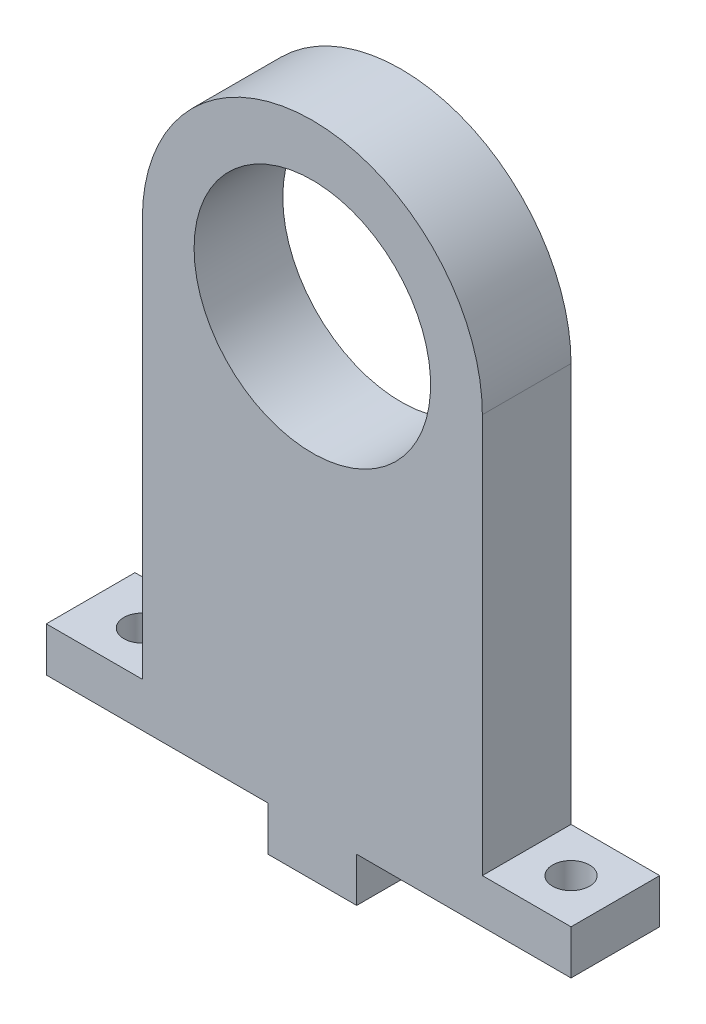
ISO-10303-21;
HEADER;
FILE_DESCRIPTION(('STEP AP214'),'2;1');
FILE_NAME('part.step','',(''),(''),'','','');
FILE_SCHEMA(('AUTOMOTIVE_DESIGN { 1 0 10303 214 1 1 1 1 }'));
ENDSEC;
DATA;
#1=APPLICATION_CONTEXT('core data for automotive mechanical design processes');
#2=APPLICATION_PROTOCOL_DEFINITION('international standard','automotive_design',2000,#1);
#3=PRODUCT_CONTEXT('',#1,'mechanical');
#4=PRODUCT('Part','Part','',(#3));
#5=PRODUCT_RELATED_PRODUCT_CATEGORY('part','',(#4));
#6=PRODUCT_DEFINITION_FORMATION('','',#4);
#7=PRODUCT_DEFINITION_CONTEXT('part definition',#1,'design');
#8=PRODUCT_DEFINITION('design','',#6,#7);
#9=PRODUCT_DEFINITION_SHAPE('','',#8);
#10=(LENGTH_UNIT() NAMED_UNIT(*) SI_UNIT(.MILLI.,.METRE.));
#11=(NAMED_UNIT(*) PLANE_ANGLE_UNIT() SI_UNIT($,.RADIAN.));
#12=(NAMED_UNIT(*) SI_UNIT($,.STERADIAN.) SOLID_ANGLE_UNIT());
#13=UNCERTAINTY_MEASURE_WITH_UNIT(LENGTH_MEASURE(1.E-05),#10,'distance_accuracy_value','');
#14=(GEOMETRIC_REPRESENTATION_CONTEXT(3) GLOBAL_UNCERTAINTY_ASSIGNED_CONTEXT((#13)) GLOBAL_UNIT_ASSIGNED_CONTEXT((#10,
#11,#12)) REPRESENTATION_CONTEXT('',''));
#15=CARTESIAN_POINT('',(0.,0.,0.));
#16=DIRECTION('',(0.,0.,1.));
#17=DIRECTION('',(1.,0.,0.));
#18=AXIS2_PLACEMENT_3D('',#15,#16,#17);
#19=CARTESIAN_POINT('',(14.5,-30.,3.));
#20=DIRECTION('',(0.,1.,0.));
#21=DIRECTION('',(0.,0.,1.));
#22=AXIS2_PLACEMENT_3D('',#19,#20,#21);
#23=CYLINDRICAL_SURFACE('',#22,1.25);
#24=CARTESIAN_POINT('',(14.5,-30.,3.));
#25=DIRECTION('',(0.,1.,0.));
#26=DIRECTION('',(0.,0.,1.));
#27=AXIS2_PLACEMENT_3D('',#24,#25,#26);
#28=CIRCLE('',#27,1.25);
#29=CARTESIAN_POINT('',(14.5,-30.,4.25));
#30=VERTEX_POINT('',#29);
#31=EDGE_CURVE('E20',#30,#30,#28,.F.);
#32=ORIENTED_EDGE('',*,*,#31,.T.);
#33=EDGE_LOOP('',(#32));
#34=FACE_BOUND('',#33,.T.);
#35=CARTESIAN_POINT('',(14.5,-27.,3.));
#36=DIRECTION('',(0.,1.,0.));
#37=DIRECTION('',(0.,0.,1.));
#38=AXIS2_PLACEMENT_3D('',#35,#36,#37);
#39=CIRCLE('',#38,1.25);
#40=CARTESIAN_POINT('',(14.5,-27.,4.25));
#41=VERTEX_POINT('',#40);
#42=EDGE_CURVE('E157',#41,#41,#39,.T.);
#43=ORIENTED_EDGE('',*,*,#42,.T.);
#44=EDGE_LOOP('',(#43));
#45=FACE_BOUND('',#44,.T.);
#46=ADVANCED_FACE('F17',(#34,#45),#23,.F.);
#47=CARTESIAN_POINT('',(-14.5,-30.,3.));
#48=DIRECTION('',(0.,1.,0.));
#49=DIRECTION('',(0.,0.,1.));
#50=AXIS2_PLACEMENT_3D('',#47,#48,#49);
#51=CYLINDRICAL_SURFACE('',#50,1.25);
#52=CARTESIAN_POINT('',(-14.5,-30.,3.));
#53=DIRECTION('',(0.,1.,0.));
#54=DIRECTION('',(0.,0.,1.));
#55=AXIS2_PLACEMENT_3D('',#52,#53,#54);
#56=CIRCLE('',#55,1.25);
#57=CARTESIAN_POINT('',(-14.5,-30.,4.25));
#58=VERTEX_POINT('',#57);
#59=EDGE_CURVE('E253',#58,#58,#56,.F.);
#60=ORIENTED_EDGE('',*,*,#59,.T.);
#61=EDGE_LOOP('',(#60));
#62=FACE_BOUND('',#61,.T.);
#63=CARTESIAN_POINT('',(-14.5,-27.,3.));
#64=DIRECTION('',(0.,1.,0.));
#65=DIRECTION('',(0.,0.,1.));
#66=AXIS2_PLACEMENT_3D('',#63,#64,#65);
#67=CIRCLE('',#66,1.25);
#68=CARTESIAN_POINT('',(-14.5,-27.,4.25));
#69=VERTEX_POINT('',#68);
#70=EDGE_CURVE('E281',#69,#69,#67,.T.);
#71=ORIENTED_EDGE('',*,*,#70,.T.);
#72=EDGE_LOOP('',(#71));
#73=FACE_BOUND('',#72,.T.);
#74=ADVANCED_FACE('F476',(#62,#73),#51,.F.);
#75=CARTESIAN_POINT('',(0.,0.,6.));
#76=DIRECTION('',(0.,0.,1.));
#77=DIRECTION('',(1.,0.,0.));
#78=AXIS2_PLACEMENT_3D('',#75,#76,#77);
#79=PLANE('',#78);
#80=CARTESIAN_POINT('',(0.,0.,6.));
#81=DIRECTION('',(0.,0.,-1.));
#82=DIRECTION('',(-1.,0.,0.));
#83=AXIS2_PLACEMENT_3D('',#80,#81,#82);
#84=CIRCLE('',#83,8.);
#85=CARTESIAN_POINT('',(-8.,0.,6.));
#86=VERTEX_POINT('',#85);
#87=EDGE_CURVE('E177',#86,#86,#84,.T.);
#88=ORIENTED_EDGE('',*,*,#87,.T.);
#89=EDGE_LOOP('',(#88));
#90=FACE_BOUND('',#89,.T.);
#91=DIRECTION('',(1.,0.,0.));
#92=VECTOR('',#91,1.);
#93=CARTESIAN_POINT('',(-2.99999999999998,-30.,6.));
#94=LINE('',#93,#92);
#95=CARTESIAN_POINT('',(-18.,-30.,6.));
#96=VERTEX_POINT('',#95);
#97=CARTESIAN_POINT('',(-2.99999999999998,-30.,6.));
#98=VERTEX_POINT('',#97);
#99=EDGE_CURVE('E236',#96,#98,#94,.T.);
#100=ORIENTED_EDGE('',*,*,#99,.T.);
#101=DIRECTION('',(0.,1.,0.));
#102=VECTOR('',#101,1.);
#103=CARTESIAN_POINT('',(-2.99999999999998,-33.,6.));
#104=LINE('',#103,#102);
#105=CARTESIAN_POINT('',(-2.99999999999998,-33.,6.));
#106=VERTEX_POINT('',#105);
#107=EDGE_CURVE('E219',#98,#106,#104,.F.);
#108=ORIENTED_EDGE('',*,*,#107,.T.);
#109=DIRECTION('',(1.,0.,0.));
#110=VECTOR('',#109,1.);
#111=CARTESIAN_POINT('',(0.,-33.,6.));
#112=LINE('',#111,#110);
#113=CARTESIAN_POINT('',(3.00000000000002,-33.,6.));
#114=VERTEX_POINT('',#113);
#115=EDGE_CURVE('E203',#106,#114,#112,.T.);
#116=ORIENTED_EDGE('',*,*,#115,.T.);
#117=DIRECTION('',(0.,-1.,0.));
#118=VECTOR('',#117,1.);
#119=CARTESIAN_POINT('',(3.00000000000002,-33.,6.));
#120=LINE('',#119,#118);
#121=CARTESIAN_POINT('',(3.00000000000002,-30.,6.));
#122=VERTEX_POINT('',#121);
#123=EDGE_CURVE('E184',#114,#122,#120,.F.);
#124=ORIENTED_EDGE('',*,*,#123,.T.);
#125=DIRECTION('',(-1.,0.,0.));
#126=VECTOR('',#125,1.);
#127=CARTESIAN_POINT('',(17.5,-30.,6.));
#128=LINE('',#127,#126);
#129=CARTESIAN_POINT('',(17.5,-30.,6.));
#130=VERTEX_POINT('',#129);
#131=EDGE_CURVE('E171',#122,#130,#128,.F.);
#132=ORIENTED_EDGE('',*,*,#131,.T.);
#133=DIRECTION('',(0.,1.,0.));
#134=VECTOR('',#133,1.);
#135=CARTESIAN_POINT('',(17.5,-27.,6.));
#136=LINE('',#135,#134);
#137=CARTESIAN_POINT('',(17.5,-27.,6.));
#138=VERTEX_POINT('',#137);
#139=EDGE_CURVE('E170',#130,#138,#136,.T.);
#140=ORIENTED_EDGE('',*,*,#139,.T.);
#141=DIRECTION('',(1.,0.,0.));
#142=VECTOR('',#141,1.);
#143=CARTESIAN_POINT('',(11.5,-27.,6.));
#144=LINE('',#143,#142);
#145=CARTESIAN_POINT('',(11.5,-27.,6.));
#146=VERTEX_POINT('',#145);
#147=EDGE_CURVE('E120',#138,#146,#144,.F.);
#148=ORIENTED_EDGE('',*,*,#147,.T.);
#149=DIRECTION('',(0.,-1.,0.));
#150=VECTOR('',#149,1.);
#151=CARTESIAN_POINT('',(11.5,0.,6.));
#152=LINE('',#151,#150);
#153=CARTESIAN_POINT('',(11.5,0.,6.));
#154=VERTEX_POINT('',#153);
#155=EDGE_CURVE('E115',#146,#154,#152,.F.);
#156=ORIENTED_EDGE('',*,*,#155,.T.);
#157=CARTESIAN_POINT('',(0.,0.,6.));
#158=DIRECTION('',(0.,0.,-1.));
#159=DIRECTION('',(-1.,0.,0.));
#160=AXIS2_PLACEMENT_3D('',#157,#158,#159);
#161=CIRCLE('',#160,11.5);
#162=CARTESIAN_POINT('',(-11.5,0.,6.));
#163=VERTEX_POINT('',#162);
#164=EDGE_CURVE('E104',#163,#154,#161,.T.);
#165=ORIENTED_EDGE('',*,*,#164,.F.);
#166=DIRECTION('',(0.,1.,0.));
#167=VECTOR('',#166,1.);
#168=CARTESIAN_POINT('',(-11.5,0.,6.));
#169=LINE('',#168,#167);
#170=CARTESIAN_POINT('',(-11.5,-27.,6.));
#171=VERTEX_POINT('',#170);
#172=EDGE_CURVE('E136',#163,#171,#169,.F.);
#173=ORIENTED_EDGE('',*,*,#172,.T.);
#174=DIRECTION('',(1.,0.,0.));
#175=VECTOR('',#174,1.);
#176=CARTESIAN_POINT('',(-11.5,-27.,6.));
#177=LINE('',#176,#175);
#178=CARTESIAN_POINT('',(-18.,-27.,6.));
#179=VERTEX_POINT('',#178);
#180=EDGE_CURVE('E271',#171,#179,#177,.F.);
#181=ORIENTED_EDGE('',*,*,#180,.T.);
#182=DIRECTION('',(0.,1.,0.));
#183=VECTOR('',#182,1.);
#184=CARTESIAN_POINT('',(-18.,-27.,6.));
#185=LINE('',#184,#183);
#186=EDGE_CURVE('E256',#179,#96,#185,.F.);
#187=ORIENTED_EDGE('',*,*,#186,.T.);
#188=EDGE_LOOP('',(#100,#108,#116,#124,#132,#140,#148,#156,#165,#173,#181,#187));
#189=FACE_BOUND('',#188,.T.);
#190=ADVANCED_FACE('F118',(#90,#189),#79,.T.);
#191=CARTESIAN_POINT('',(17.5,-30.,6.));
#192=DIRECTION('',(0.,1.,0.));
#193=DIRECTION('',(-1.,0.,0.));
#194=AXIS2_PLACEMENT_3D('',#191,#192,#193);
#195=PLANE('',#194);
#196=DIRECTION('',(0.,0.,1.));
#197=VECTOR('',#196,1.);
#198=CARTESIAN_POINT('',(17.5,-30.,6.));
#199=LINE('',#198,#197);
#200=CARTESIAN_POINT('',(17.5,-30.,0.));
#201=VERTEX_POINT('',#200);
#202=EDGE_CURVE('E166',#201,#130,#199,.T.);
#203=ORIENTED_EDGE('',*,*,#202,.T.);
#204=ORIENTED_EDGE('',*,*,#131,.F.);
#205=DIRECTION('',(0.,0.,1.));
#206=VECTOR('',#205,1.);
#207=CARTESIAN_POINT('',(3.00000000000002,-30.,6.));
#208=LINE('',#207,#206);
#209=CARTESIAN_POINT('',(3.00000000000002,-30.,0.));
#210=VERTEX_POINT('',#209);
#211=EDGE_CURVE('E180',#122,#210,#208,.F.);
#212=ORIENTED_EDGE('',*,*,#211,.T.);
#213=DIRECTION('',(1.,0.,0.));
#214=VECTOR('',#213,1.);
#215=CARTESIAN_POINT('',(0.,-30.,0.));
#216=LINE('',#215,#214);
#217=EDGE_CURVE('E163',#210,#201,#216,.T.);
#218=ORIENTED_EDGE('',*,*,#217,.T.);
#219=EDGE_LOOP('',(#203,#204,#212,#218));
#220=FACE_BOUND('',#219,.T.);
#221=ORIENTED_EDGE('',*,*,#31,.F.);
#222=EDGE_LOOP('',(#221));
#223=FACE_BOUND('',#222,.T.);
#224=ADVANCED_FACE('F321',(#220,#223),#195,.F.);
#225=CARTESIAN_POINT('',(17.5,-27.,6.));
#226=DIRECTION('',(-1.,0.,0.));
#227=DIRECTION('',(0.,0.,1.));
#228=AXIS2_PLACEMENT_3D('',#225,#226,#227);
#229=PLANE('',#228);
#230=DIRECTION('',(0.,0.,-1.));
#231=VECTOR('',#230,1.);
#232=CARTESIAN_POINT('',(17.5,-27.,6.));
#233=LINE('',#232,#231);
#234=CARTESIAN_POINT('',(17.5,-27.,0.));
#235=VERTEX_POINT('',#234);
#236=EDGE_CURVE('E153',#235,#138,#233,.F.);
#237=ORIENTED_EDGE('',*,*,#236,.T.);
#238=ORIENTED_EDGE('',*,*,#139,.F.);
#239=ORIENTED_EDGE('',*,*,#202,.F.);
#240=DIRECTION('',(0.,1.,0.));
#241=VECTOR('',#240,1.);
#242=CARTESIAN_POINT('',(17.5,0.,0.));
#243=LINE('',#242,#241);
#244=EDGE_CURVE('E150',#201,#235,#243,.T.);
#245=ORIENTED_EDGE('',*,*,#244,.T.);
#246=EDGE_LOOP('',(#237,#238,#239,#245));
#247=FACE_BOUND('',#246,.T.);
#248=ADVANCED_FACE('F312',(#247),#229,.F.);
#249=CARTESIAN_POINT('',(11.5,-27.,6.));
#250=DIRECTION('',(0.,-1.,0.));
#251=DIRECTION('',(0.,0.,-1.));
#252=AXIS2_PLACEMENT_3D('',#249,#250,#251);
#253=PLANE('',#252);
#254=DIRECTION('',(0.,0.,1.));
#255=VECTOR('',#254,1.);
#256=CARTESIAN_POINT('',(11.5,-27.,6.));
#257=LINE('',#256,#255);
#258=CARTESIAN_POINT('',(11.5,-27.,0.));
#259=VERTEX_POINT('',#258);
#260=EDGE_CURVE('E124',#259,#146,#257,.T.);
#261=ORIENTED_EDGE('',*,*,#260,.T.);
#262=ORIENTED_EDGE('',*,*,#147,.F.);
#263=ORIENTED_EDGE('',*,*,#236,.F.);
#264=DIRECTION('',(1.,0.,0.));
#265=VECTOR('',#264,1.);
#266=CARTESIAN_POINT('',(0.,-27.,0.));
#267=LINE('',#266,#265);
#268=EDGE_CURVE('E146',#235,#259,#267,.F.);
#269=ORIENTED_EDGE('',*,*,#268,.T.);
#270=EDGE_LOOP('',(#261,#262,#263,#269));
#271=FACE_BOUND('',#270,.T.);
#272=ORIENTED_EDGE('',*,*,#42,.F.);
#273=EDGE_LOOP('',(#272));
#274=FACE_BOUND('',#273,.T.);
#275=ADVANCED_FACE('F310',(#271,#274),#253,.F.);
#276=CARTESIAN_POINT('',(11.5,0.,6.));
#277=DIRECTION('',(-1.,0.,0.));
#278=DIRECTION('',(0.,-1.,0.));
#279=AXIS2_PLACEMENT_3D('',#276,#277,#278);
#280=PLANE('',#279);
#281=DIRECTION('',(0.,0.,-1.));
#282=VECTOR('',#281,1.);
#283=CARTESIAN_POINT('',(11.5,0.,6.));
#284=LINE('',#283,#282);
#285=CARTESIAN_POINT('',(11.5,0.,0.));
#286=VERTEX_POINT('',#285);
#287=EDGE_CURVE('E111',#154,#286,#284,.T.);
#288=ORIENTED_EDGE('',*,*,#287,.F.);
#289=ORIENTED_EDGE('',*,*,#155,.F.);
#290=ORIENTED_EDGE('',*,*,#260,.F.);
#291=DIRECTION('',(0.,1.,0.));
#292=VECTOR('',#291,1.);
#293=CARTESIAN_POINT('',(11.5,0.,0.));
#294=LINE('',#293,#292);
#295=EDGE_CURVE('E129',#259,#286,#294,.T.);
#296=ORIENTED_EDGE('',*,*,#295,.T.);
#297=EDGE_LOOP('',(#288,#289,#290,#296));
#298=FACE_BOUND('',#297,.T.);
#299=ADVANCED_FACE('F127',(#298),#280,.F.);
#300=CARTESIAN_POINT('',(0.,0.,6.));
#301=DIRECTION('',(0.,0.,-1.));
#302=DIRECTION('',(-1.,0.,0.));
#303=AXIS2_PLACEMENT_3D('',#300,#301,#302);
#304=CYLINDRICAL_SURFACE('',#303,11.5);
#305=ORIENTED_EDGE('',*,*,#164,.T.);
#306=ORIENTED_EDGE('',*,*,#287,.T.);
#307=CARTESIAN_POINT('',(0.,0.,0.));
#308=DIRECTION('',(0.,0.,-1.));
#309=DIRECTION('',(-1.,0.,0.));
#310=AXIS2_PLACEMENT_3D('',#307,#308,#309);
#311=CIRCLE('',#310,11.5);
#312=CARTESIAN_POINT('',(-11.5,0.,0.));
#313=VERTEX_POINT('',#312);
#314=EDGE_CURVE('E294',#286,#313,#311,.F.);
#315=ORIENTED_EDGE('',*,*,#314,.T.);
#316=DIRECTION('',(0.,0.,1.));
#317=VECTOR('',#316,1.);
#318=CARTESIAN_POINT('',(-11.5,0.,6.));
#319=LINE('',#318,#317);
#320=EDGE_CURVE('E113',#313,#163,#319,.T.);
#321=ORIENTED_EDGE('',*,*,#320,.T.);
#322=EDGE_LOOP('',(#305,#306,#315,#321));
#323=FACE_BOUND('',#322,.T.);
#324=ADVANCED_FACE('F108',(#323),#304,.T.);
#325=CARTESIAN_POINT('',(-11.5,0.,6.));
#326=DIRECTION('',(1.,0.,0.));
#327=DIRECTION('',(0.,1.,0.));
#328=AXIS2_PLACEMENT_3D('',#325,#326,#327);
#329=PLANE('',#328);
#330=DIRECTION('',(0.,0.,1.));
#331=VECTOR('',#330,1.);
#332=CARTESIAN_POINT('',(-11.5,-27.,6.));
#333=LINE('',#332,#331);
#334=CARTESIAN_POINT('',(-11.5,-27.,0.));
#335=VERTEX_POINT('',#334);
#336=EDGE_CURVE('E276',#335,#171,#333,.T.);
#337=ORIENTED_EDGE('',*,*,#336,.T.);
#338=ORIENTED_EDGE('',*,*,#172,.F.);
#339=ORIENTED_EDGE('',*,*,#320,.F.);
#340=DIRECTION('',(0.,1.,0.));
#341=VECTOR('',#340,1.);
#342=CARTESIAN_POINT('',(-11.5,0.,0.));
#343=LINE('',#342,#341);
#344=EDGE_CURVE('E296',#313,#335,#343,.F.);
#345=ORIENTED_EDGE('',*,*,#344,.T.);
#346=EDGE_LOOP('',(#337,#338,#339,#345));
#347=FACE_BOUND('',#346,.T.);
#348=ADVANCED_FACE('F359',(#347),#329,.F.);
#349=CARTESIAN_POINT('',(-11.5,-27.,6.));
#350=DIRECTION('',(0.,-1.,0.));
#351=DIRECTION('',(1.,0.,0.));
#352=AXIS2_PLACEMENT_3D('',#349,#350,#351);
#353=PLANE('',#352);
#354=DIRECTION('',(0.,0.,1.));
#355=VECTOR('',#354,1.);
#356=CARTESIAN_POINT('',(-18.,-27.,6.));
#357=LINE('',#356,#355);
#358=CARTESIAN_POINT('',(-18.,-27.,0.));
#359=VERTEX_POINT('',#358);
#360=EDGE_CURVE('E259',#359,#179,#357,.T.);
#361=ORIENTED_EDGE('',*,*,#360,.T.);
#362=ORIENTED_EDGE('',*,*,#180,.F.);
#363=ORIENTED_EDGE('',*,*,#336,.F.);
#364=DIRECTION('',(1.,0.,0.));
#365=VECTOR('',#364,1.);
#366=CARTESIAN_POINT('',(0.,-27.,0.));
#367=LINE('',#366,#365);
#368=EDGE_CURVE('E265',#335,#359,#367,.F.);
#369=ORIENTED_EDGE('',*,*,#368,.T.);
#370=EDGE_LOOP('',(#361,#362,#363,#369));
#371=FACE_BOUND('',#370,.T.);
#372=ORIENTED_EDGE('',*,*,#70,.F.);
#373=EDGE_LOOP('',(#372));
#374=FACE_BOUND('',#373,.T.);
#375=ADVANCED_FACE('F355',(#371,#374),#353,.F.);
#376=CARTESIAN_POINT('',(-18.,-27.,6.));
#377=DIRECTION('',(1.,0.,0.));
#378=DIRECTION('',(0.,1.,0.));
#379=AXIS2_PLACEMENT_3D('',#376,#377,#378);
#380=PLANE('',#379);
#381=DIRECTION('',(0.,0.,1.));
#382=VECTOR('',#381,1.);
#383=CARTESIAN_POINT('',(-18.,-30.,6.));
#384=LINE('',#383,#382);
#385=CARTESIAN_POINT('',(-18.,-30.,0.));
#386=VERTEX_POINT('',#385);
#387=EDGE_CURVE('E241',#386,#96,#384,.T.);
#388=ORIENTED_EDGE('',*,*,#387,.T.);
#389=ORIENTED_EDGE('',*,*,#186,.F.);
#390=ORIENTED_EDGE('',*,*,#360,.F.);
#391=DIRECTION('',(0.,1.,0.));
#392=VECTOR('',#391,1.);
#393=CARTESIAN_POINT('',(-18.,0.,0.));
#394=LINE('',#393,#392);
#395=EDGE_CURVE('E247',#359,#386,#394,.F.);
#396=ORIENTED_EDGE('',*,*,#395,.T.);
#397=EDGE_LOOP('',(#388,#389,#390,#396));
#398=FACE_BOUND('',#397,.T.);
#399=ADVANCED_FACE('F351',(#398),#380,.F.);
#400=CARTESIAN_POINT('',(-2.99999999999998,-30.,6.));
#401=DIRECTION('',(0.,1.,0.));
#402=DIRECTION('',(0.,0.,1.));
#403=AXIS2_PLACEMENT_3D('',#400,#401,#402);
#404=PLANE('',#403);
#405=DIRECTION('',(0.,0.,-1.));
#406=VECTOR('',#405,1.);
#407=CARTESIAN_POINT('',(-2.99999999999998,-30.,6.));
#408=LINE('',#407,#406);
#409=CARTESIAN_POINT('',(-2.99999999999998,-30.,0.));
#410=VERTEX_POINT('',#409);
#411=EDGE_CURVE('E224',#410,#98,#408,.F.);
#412=ORIENTED_EDGE('',*,*,#411,.T.);
#413=ORIENTED_EDGE('',*,*,#99,.F.);
#414=ORIENTED_EDGE('',*,*,#387,.F.);
#415=DIRECTION('',(1.,0.,0.));
#416=VECTOR('',#415,1.);
#417=CARTESIAN_POINT('',(0.,-30.,0.));
#418=LINE('',#417,#416);
#419=EDGE_CURVE('E230',#386,#410,#418,.T.);
#420=ORIENTED_EDGE('',*,*,#419,.T.);
#421=EDGE_LOOP('',(#412,#413,#414,#420));
#422=FACE_BOUND('',#421,.T.);
#423=ORIENTED_EDGE('',*,*,#59,.F.);
#424=EDGE_LOOP('',(#423));
#425=FACE_BOUND('',#424,.T.);
#426=ADVANCED_FACE('F347',(#422,#425),#404,.F.);
#427=CARTESIAN_POINT('',(-2.99999999999998,-33.,6.));
#428=DIRECTION('',(1.,0.,0.));
#429=DIRECTION('',(0.,0.,-1.));
#430=AXIS2_PLACEMENT_3D('',#427,#428,#429);
#431=PLANE('',#430);
#432=DIRECTION('',(0.,0.,1.));
#433=VECTOR('',#432,1.);
#434=CARTESIAN_POINT('',(-2.99999999999998,-33.,6.));
#435=LINE('',#434,#433);
#436=CARTESIAN_POINT('',(-2.99999999999998,-33.,0.));
#437=VERTEX_POINT('',#436);
#438=EDGE_CURVE('E208',#437,#106,#435,.T.);
#439=ORIENTED_EDGE('',*,*,#438,.T.);
#440=ORIENTED_EDGE('',*,*,#107,.F.);
#441=ORIENTED_EDGE('',*,*,#411,.F.);
#442=DIRECTION('',(0.,1.,0.));
#443=VECTOR('',#442,1.);
#444=CARTESIAN_POINT('',(-2.99999999999998,0.,0.));
#445=LINE('',#444,#443);
#446=EDGE_CURVE('E214',#410,#437,#445,.F.);
#447=ORIENTED_EDGE('',*,*,#446,.T.);
#448=EDGE_LOOP('',(#439,#440,#441,#447));
#449=FACE_BOUND('',#448,.T.);
#450=ADVANCED_FACE('F343',(#449),#431,.F.);
#451=CARTESIAN_POINT('',(0.,-33.,6.));
#452=DIRECTION('',(0.,1.,0.));
#453=DIRECTION('',(0.,0.,1.));
#454=AXIS2_PLACEMENT_3D('',#451,#452,#453);
#455=PLANE('',#454);
#456=DIRECTION('',(0.,0.,1.));
#457=VECTOR('',#456,1.);
#458=CARTESIAN_POINT('',(3.00000000000002,-33.,6.));
#459=LINE('',#458,#457);
#460=CARTESIAN_POINT('',(3.00000000000002,-33.,0.));
#461=VERTEX_POINT('',#460);
#462=EDGE_CURVE('E36',#461,#114,#459,.T.);
#463=ORIENTED_EDGE('',*,*,#462,.T.);
#464=ORIENTED_EDGE('',*,*,#115,.F.);
#465=ORIENTED_EDGE('',*,*,#438,.F.);
#466=DIRECTION('',(1.,0.,0.));
#467=VECTOR('',#466,1.);
#468=CARTESIAN_POINT('',(0.,-33.,0.));
#469=LINE('',#468,#467);
#470=EDGE_CURVE('E189',#437,#461,#469,.T.);
#471=ORIENTED_EDGE('',*,*,#470,.T.);
#472=EDGE_LOOP('',(#463,#464,#465,#471));
#473=FACE_BOUND('',#472,.T.);
#474=ADVANCED_FACE('F340',(#473),#455,.F.);
#475=CARTESIAN_POINT('',(3.00000000000002,-33.,6.));
#476=DIRECTION('',(-1.,0.,0.));
#477=DIRECTION('',(0.,-1.,0.));
#478=AXIS2_PLACEMENT_3D('',#475,#476,#477);
#479=PLANE('',#478);
#480=ORIENTED_EDGE('',*,*,#211,.F.);
#481=ORIENTED_EDGE('',*,*,#123,.F.);
#482=ORIENTED_EDGE('',*,*,#462,.F.);
#483=DIRECTION('',(0.,1.,0.));
#484=VECTOR('',#483,1.);
#485=CARTESIAN_POINT('',(3.00000000000002,0.,0.));
#486=LINE('',#485,#484);
#487=EDGE_CURVE('E27',#461,#210,#486,.T.);
#488=ORIENTED_EDGE('',*,*,#487,.T.);
#489=EDGE_LOOP('',(#480,#481,#482,#488));
#490=FACE_BOUND('',#489,.T.);
#491=ADVANCED_FACE('F332',(#490),#479,.F.);
#492=CARTESIAN_POINT('',(0.,0.,6.));
#493=DIRECTION('',(0.,0.,-1.));
#494=DIRECTION('',(-1.,0.,0.));
#495=AXIS2_PLACEMENT_3D('',#492,#493,#494);
#496=CYLINDRICAL_SURFACE('',#495,8.);
#497=CARTESIAN_POINT('',(0.,0.,0.));
#498=DIRECTION('',(0.,0.,-1.));
#499=DIRECTION('',(-1.,0.,0.));
#500=AXIS2_PLACEMENT_3D('',#497,#498,#499);
#501=CIRCLE('',#500,8.);
#502=CARTESIAN_POINT('',(-8.,0.,0.));
#503=VERTEX_POINT('',#502);
#504=EDGE_CURVE('E11',#503,#503,#501,.T.);
#505=ORIENTED_EDGE('',*,*,#504,.T.);
#506=EDGE_LOOP('',(#505));
#507=FACE_BOUND('',#506,.T.);
#508=ORIENTED_EDGE('',*,*,#87,.F.);
#509=EDGE_LOOP('',(#508));
#510=FACE_BOUND('',#509,.T.);
#511=ADVANCED_FACE('F326',(#507,#510),#496,.F.);
#512=CARTESIAN_POINT('',(0.,0.,0.));
#513=DIRECTION('',(0.,0.,1.));
#514=DIRECTION('',(1.,0.,0.));
#515=AXIS2_PLACEMENT_3D('',#512,#513,#514);
#516=PLANE('',#515);
#517=ORIENTED_EDGE('',*,*,#504,.F.);
#518=EDGE_LOOP('',(#517));
#519=FACE_BOUND('',#518,.T.);
#520=ORIENTED_EDGE('',*,*,#470,.F.);
#521=ORIENTED_EDGE('',*,*,#446,.F.);
#522=ORIENTED_EDGE('',*,*,#419,.F.);
#523=ORIENTED_EDGE('',*,*,#395,.F.);
#524=ORIENTED_EDGE('',*,*,#368,.F.);
#525=ORIENTED_EDGE('',*,*,#344,.F.);
#526=ORIENTED_EDGE('',*,*,#314,.F.);
#527=ORIENTED_EDGE('',*,*,#295,.F.);
#528=ORIENTED_EDGE('',*,*,#268,.F.);
#529=ORIENTED_EDGE('',*,*,#244,.F.);
#530=ORIENTED_EDGE('',*,*,#217,.F.);
#531=ORIENTED_EDGE('',*,*,#487,.F.);
#532=EDGE_LOOP('',(#520,#521,#522,#523,#524,#525,#526,#527,#528,#529,#530,#531));
#533=FACE_BOUND('',#532,.T.);
#534=ADVANCED_FACE('F324',(#519,#533),#516,.F.);
#535=CLOSED_SHELL('',(#46,#74,#190,#224,#248,#275,#299,#324,#348,#375,#399,#426,#450,#474,#491,
#511,#534));
#536=MANIFOLD_SOLID_BREP('B1',#535);
#537=ADVANCED_BREP_SHAPE_REPRESENTATION('',(#18,#536),#14);
#538=SHAPE_DEFINITION_REPRESENTATION(#9,#537);
ENDSEC;
END-ISO-10303-21;
